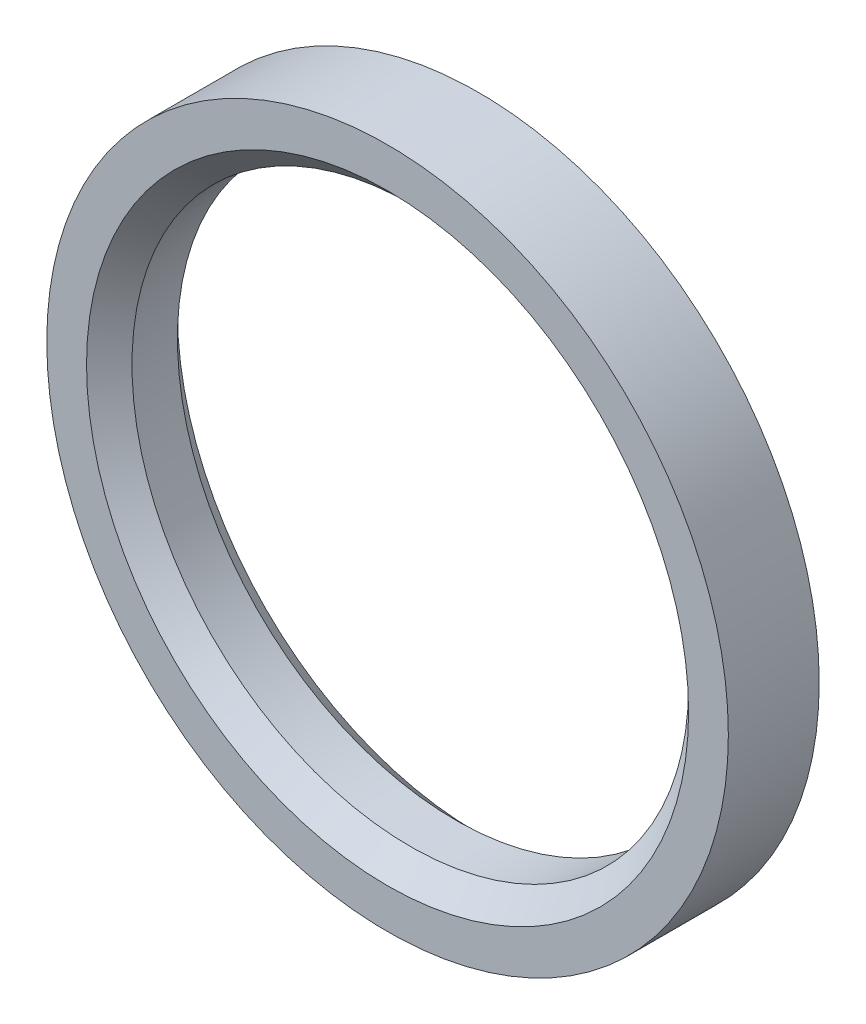
ISO-10303-21;
HEADER;
FILE_DESCRIPTION(('STEP AP214'),'2;1');
FILE_NAME('part.step','',(''),(''),'','','');
FILE_SCHEMA(('AUTOMOTIVE_DESIGN { 1 0 10303 214 1 1 1 1 }'));
ENDSEC;
DATA;
#1=APPLICATION_CONTEXT('core data for automotive mechanical design processes');
#2=APPLICATION_PROTOCOL_DEFINITION('international standard','automotive_design',2000,#1);
#3=PRODUCT_CONTEXT('',#1,'mechanical');
#4=PRODUCT('Part','Part','',(#3));
#5=PRODUCT_RELATED_PRODUCT_CATEGORY('part','',(#4));
#6=PRODUCT_DEFINITION_FORMATION('','',#4);
#7=PRODUCT_DEFINITION_CONTEXT('part definition',#1,'design');
#8=PRODUCT_DEFINITION('design','',#6,#7);
#9=PRODUCT_DEFINITION_SHAPE('','',#8);
#10=(LENGTH_UNIT() NAMED_UNIT(*) SI_UNIT(.MILLI.,.METRE.));
#11=(NAMED_UNIT(*) PLANE_ANGLE_UNIT() SI_UNIT($,.RADIAN.));
#12=(NAMED_UNIT(*) SI_UNIT($,.STERADIAN.) SOLID_ANGLE_UNIT());
#13=UNCERTAINTY_MEASURE_WITH_UNIT(LENGTH_MEASURE(1.E-05),#10,'distance_accuracy_value','');
#14=(GEOMETRIC_REPRESENTATION_CONTEXT(3) GLOBAL_UNCERTAINTY_ASSIGNED_CONTEXT((#13)) GLOBAL_UNIT_ASSIGNED_CONTEXT((#10,
#11,#12)) REPRESENTATION_CONTEXT('',''));
#15=CARTESIAN_POINT('',(0.,0.,0.));
#16=DIRECTION('',(0.,0.,1.));
#17=DIRECTION('',(1.,0.,0.));
#18=AXIS2_PLACEMENT_3D('',#15,#16,#17);
#19=CARTESIAN_POINT('',(0.,0.,4.));
#20=DIRECTION('',(0.,0.,1.));
#21=DIRECTION('',(1.,0.,0.));
#22=AXIS2_PLACEMENT_3D('',#19,#20,#21);
#23=PLANE('',#22);
#24=CARTESIAN_POINT('',(0.,0.,4.));
#25=DIRECTION('',(0.,0.,1.));
#26=DIRECTION('',(1.,0.,0.));
#27=AXIS2_PLACEMENT_3D('',#24,#25,#26);
#28=CIRCLE('',#27,13.25);
#29=CARTESIAN_POINT('',(13.25,0.,4.));
#30=VERTEX_POINT('',#29);
#31=EDGE_CURVE('E40',#30,#30,#28,.F.);
#32=ORIENTED_EDGE('',*,*,#31,.T.);
#33=EDGE_LOOP('',(#32));
#34=FACE_BOUND('',#33,.T.);
#35=CARTESIAN_POINT('',(0.,0.,4.));
#36=DIRECTION('',(0.,0.,1.));
#37=DIRECTION('',(1.,0.,0.));
#38=AXIS2_PLACEMENT_3D('',#35,#36,#37);
#39=CIRCLE('',#38,15.);
#40=CARTESIAN_POINT('',(15.,0.,4.));
#41=VERTEX_POINT('',#40);
#42=EDGE_CURVE('E53',#41,#41,#39,.T.);
#43=ORIENTED_EDGE('',*,*,#42,.T.);
#44=EDGE_LOOP('',(#43));
#45=FACE_BOUND('',#44,.T.);
#46=ADVANCED_FACE('F33',(#34,#45),#23,.T.);
#47=CARTESIAN_POINT('',(0.,0.,0.));
#48=DIRECTION('',(0.,0.,1.));
#49=DIRECTION('',(1.,0.,0.));
#50=AXIS2_PLACEMENT_3D('',#47,#48,#49);
#51=PLANE('',#50);
#52=CARTESIAN_POINT('',(0.,0.,0.));
#53=DIRECTION('',(0.,0.,1.));
#54=DIRECTION('',(1.,0.,0.));
#55=AXIS2_PLACEMENT_3D('',#52,#53,#54);
#56=CIRCLE('',#55,13.25);
#57=CARTESIAN_POINT('',(13.25,0.,0.));
#58=VERTEX_POINT('',#57);
#59=EDGE_CURVE('E10',#58,#58,#56,.T.);
#60=ORIENTED_EDGE('',*,*,#59,.T.);
#61=EDGE_LOOP('',(#60));
#62=FACE_BOUND('',#61,.T.);
#63=CARTESIAN_POINT('',(0.,0.,0.));
#64=DIRECTION('',(0.,0.,1.));
#65=DIRECTION('',(1.,0.,0.));
#66=AXIS2_PLACEMENT_3D('',#63,#64,#65);
#67=CIRCLE('',#66,15.);
#68=CARTESIAN_POINT('',(15.,0.,0.));
#69=VERTEX_POINT('',#68);
#70=EDGE_CURVE('E54',#69,#69,#67,.T.);
#71=ORIENTED_EDGE('',*,*,#70,.F.);
#72=EDGE_LOOP('',(#71));
#73=FACE_BOUND('',#72,.T.);
#74=ADVANCED_FACE('F65',(#62,#73),#51,.F.);
#75=CARTESIAN_POINT('',(0.,0.,4.));
#76=DIRECTION('',(0.,0.,-1.));
#77=DIRECTION('',(-1.,0.,0.));
#78=AXIS2_PLACEMENT_3D('',#75,#76,#77);
#79=CYLINDRICAL_SURFACE('',#78,15.);
#80=ORIENTED_EDGE('',*,*,#42,.F.);
#81=EDGE_LOOP('',(#80));
#82=FACE_BOUND('',#81,.T.);
#83=ORIENTED_EDGE('',*,*,#70,.T.);
#84=EDGE_LOOP('',(#83));
#85=FACE_BOUND('',#84,.T.);
#86=ADVANCED_FACE('F61',(#82,#85),#79,.T.);
#87=CARTESIAN_POINT('',(0.,0.,4.));
#88=DIRECTION('',(0.,0.,-1.));
#89=DIRECTION('',(-1.,0.,0.));
#90=AXIS2_PLACEMENT_3D('',#87,#88,#89);
#91=CYLINDRICAL_SURFACE('',#90,12.25);
#92=CARTESIAN_POINT('',(0.,0.,2.99999999999999));
#93=DIRECTION('',(0.,0.,1.));
#94=DIRECTION('',(1.,0.,0.));
#95=AXIS2_PLACEMENT_3D('',#92,#93,#94);
#96=CIRCLE('',#95,12.25);
#97=CARTESIAN_POINT('',(12.25,0.,2.99999999999999));
#98=VERTEX_POINT('',#97);
#99=EDGE_CURVE('E44',#98,#98,#96,.T.);
#100=ORIENTED_EDGE('',*,*,#99,.T.);
#101=EDGE_LOOP('',(#100));
#102=FACE_BOUND('',#101,.T.);
#103=CARTESIAN_POINT('',(0.,0.,1.));
#104=DIRECTION('',(0.,0.,1.));
#105=DIRECTION('',(1.,0.,0.));
#106=AXIS2_PLACEMENT_3D('',#103,#104,#105);
#107=CIRCLE('',#106,12.25);
#108=CARTESIAN_POINT('',(12.25,0.,1.));
#109=VERTEX_POINT('',#108);
#110=EDGE_CURVE('E48',#109,#109,#107,.F.);
#111=ORIENTED_EDGE('',*,*,#110,.T.);
#112=EDGE_LOOP('',(#111));
#113=FACE_BOUND('',#112,.T.);
#114=ADVANCED_FACE('F64',(#102,#113),#91,.F.);
#115=CARTESIAN_POINT('',(0.,0.,2.99999999999999));
#116=DIRECTION('',(0.,0.,1.));
#117=DIRECTION('',(1.,0.,0.));
#118=AXIS2_PLACEMENT_3D('',#115,#116,#117);
#119=CONICAL_SURFACE('',#118,12.25,0.785398163397448);
#120=ORIENTED_EDGE('',*,*,#31,.F.);
#121=EDGE_LOOP('',(#120));
#122=FACE_BOUND('',#121,.T.);
#123=ORIENTED_EDGE('',*,*,#99,.F.);
#124=EDGE_LOOP('',(#123));
#125=FACE_BOUND('',#124,.T.);
#126=ADVANCED_FACE('F76',(#122,#125),#119,.F.);
#127=CARTESIAN_POINT('',(0.,0.,0.));
#128=DIRECTION('',(0.,0.,-1.));
#129=DIRECTION('',(-1.,0.,0.));
#130=AXIS2_PLACEMENT_3D('',#127,#128,#129);
#131=CONICAL_SURFACE('',#130,13.25,0.785398163397447);
#132=ORIENTED_EDGE('',*,*,#110,.F.);
#133=EDGE_LOOP('',(#132));
#134=FACE_BOUND('',#133,.T.);
#135=ORIENTED_EDGE('',*,*,#59,.F.);
#136=EDGE_LOOP('',(#135));
#137=FACE_BOUND('',#136,.T.);
#138=ADVANCED_FACE('F35',(#134,#137),#131,.F.);
#139=CLOSED_SHELL('',(#46,#74,#86,#114,#126,#138));
#140=MANIFOLD_SOLID_BREP('B2',#139);
#141=ADVANCED_BREP_SHAPE_REPRESENTATION('',(#18,#140),#14);
#142=SHAPE_DEFINITION_REPRESENTATION(#9,#141);
ENDSEC;
END-ISO-10303-21;
